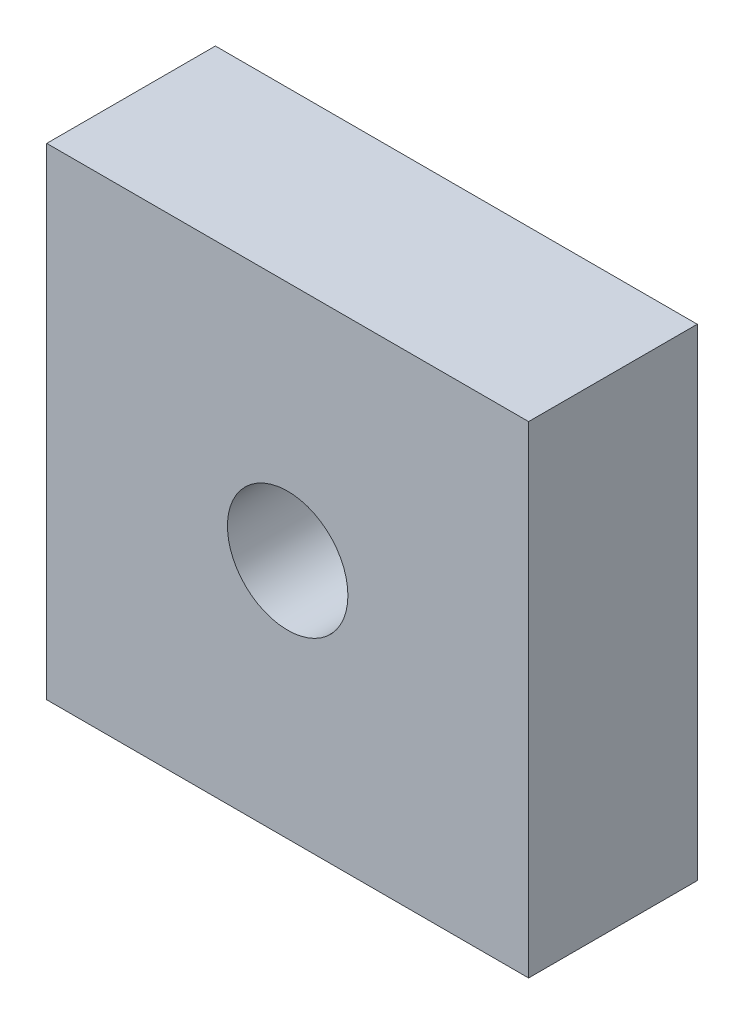
ISO-10303-21;
HEADER;
FILE_DESCRIPTION(('STEP AP214'),'2;1');
FILE_NAME('part.step','',(''),(''),'','','');
FILE_SCHEMA(('AUTOMOTIVE_DESIGN { 1 0 10303 214 1 1 1 1 }'));
ENDSEC;
DATA;
#1=APPLICATION_CONTEXT('core data for automotive mechanical design processes');
#2=APPLICATION_PROTOCOL_DEFINITION('international standard','automotive_design',2000,#1);
#3=PRODUCT_CONTEXT('',#1,'mechanical');
#4=PRODUCT('Part','Part','',(#3));
#5=PRODUCT_RELATED_PRODUCT_CATEGORY('part','',(#4));
#6=PRODUCT_DEFINITION_FORMATION('','',#4);
#7=PRODUCT_DEFINITION_CONTEXT('part definition',#1,'design');
#8=PRODUCT_DEFINITION('design','',#6,#7);
#9=PRODUCT_DEFINITION_SHAPE('','',#8);
#10=(LENGTH_UNIT() NAMED_UNIT(*) SI_UNIT(.MILLI.,.METRE.));
#11=(NAMED_UNIT(*) PLANE_ANGLE_UNIT() SI_UNIT($,.RADIAN.));
#12=(NAMED_UNIT(*) SI_UNIT($,.STERADIAN.) SOLID_ANGLE_UNIT());
#13=UNCERTAINTY_MEASURE_WITH_UNIT(LENGTH_MEASURE(1.E-05),#10,'distance_accuracy_value','');
#14=(GEOMETRIC_REPRESENTATION_CONTEXT(3) GLOBAL_UNCERTAINTY_ASSIGNED_CONTEXT((#13)) GLOBAL_UNIT_ASSIGNED_CONTEXT((#10,
#11,#12)) REPRESENTATION_CONTEXT('',''));
#15=CARTESIAN_POINT('',(0.,0.,0.));
#16=DIRECTION('',(0.,0.,1.));
#17=DIRECTION('',(1.,0.,0.));
#18=AXIS2_PLACEMENT_3D('',#15,#16,#17);
#19=CARTESIAN_POINT('',(0.,0.,7.));
#20=DIRECTION('',(0.,0.,-1.));
#21=DIRECTION('',(-1.,0.,0.));
#22=AXIS2_PLACEMENT_3D('',#19,#20,#21);
#23=PLANE('',#22);
#24=DIRECTION('',(0.,-1.,0.));
#25=VECTOR('',#24,1.);
#26=CARTESIAN_POINT('',(-10.,10.,7.));
#27=LINE('',#26,#25);
#28=CARTESIAN_POINT('',(-10.,10.,7.));
#29=VERTEX_POINT('',#28);
#30=CARTESIAN_POINT('',(-10.,-10.,7.));
#31=VERTEX_POINT('',#30);
#32=EDGE_CURVE('E89',#29,#31,#27,.T.);
#33=ORIENTED_EDGE('',*,*,#32,.T.);
#34=DIRECTION('',(1.,0.,0.));
#35=VECTOR('',#34,1.);
#36=CARTESIAN_POINT('',(10.,-10.,7.));
#37=LINE('',#36,#35);
#38=CARTESIAN_POINT('',(10.,-10.,7.));
#39=VERTEX_POINT('',#38);
#40=EDGE_CURVE('E84',#31,#39,#37,.T.);
#41=ORIENTED_EDGE('',*,*,#40,.T.);
#42=DIRECTION('',(0.,1.,0.));
#43=VECTOR('',#42,1.);
#44=CARTESIAN_POINT('',(10.,10.,7.));
#45=LINE('',#44,#43);
#46=CARTESIAN_POINT('',(10.,10.,7.));
#47=VERTEX_POINT('',#46);
#48=EDGE_CURVE('E87',#39,#47,#45,.T.);
#49=ORIENTED_EDGE('',*,*,#48,.T.);
#50=DIRECTION('',(-1.,0.,0.));
#51=VECTOR('',#50,1.);
#52=CARTESIAN_POINT('',(10.,10.,7.));
#53=LINE('',#52,#51);
#54=EDGE_CURVE('E54',#47,#29,#53,.T.);
#55=ORIENTED_EDGE('',*,*,#54,.T.);
#56=EDGE_LOOP('',(#33,#41,#49,#55));
#57=FACE_BOUND('',#56,.T.);
#58=CARTESIAN_POINT('',(0.,0.,7.));
#59=DIRECTION('',(0.,0.,1.));
#60=DIRECTION('',(1.,0.,0.));
#61=AXIS2_PLACEMENT_3D('',#58,#59,#60);
#62=CIRCLE('',#61,2.5);
#63=CARTESIAN_POINT('',(2.5,0.,7.));
#64=VERTEX_POINT('',#63);
#65=EDGE_CURVE('E104',#64,#64,#62,.T.);
#66=ORIENTED_EDGE('',*,*,#65,.F.);
#67=EDGE_LOOP('',(#66));
#68=FACE_BOUND('',#67,.T.);
#69=ADVANCED_FACE('F37',(#57,#68),#23,.F.);
#70=CARTESIAN_POINT('',(0.,0.,0.));
#71=DIRECTION('',(0.,0.,-1.));
#72=DIRECTION('',(-1.,0.,0.));
#73=AXIS2_PLACEMENT_3D('',#70,#71,#72);
#74=PLANE('',#73);
#75=DIRECTION('',(0.,-1.,0.));
#76=VECTOR('',#75,1.);
#77=CARTESIAN_POINT('',(-10.,10.,0.));
#78=LINE('',#77,#76);
#79=CARTESIAN_POINT('',(-10.,10.,0.));
#80=VERTEX_POINT('',#79);
#81=CARTESIAN_POINT('',(-10.,-10.,0.));
#82=VERTEX_POINT('',#81);
#83=EDGE_CURVE('E101',#80,#82,#78,.T.);
#84=ORIENTED_EDGE('',*,*,#83,.F.);
#85=DIRECTION('',(-1.,0.,0.));
#86=VECTOR('',#85,1.);
#87=CARTESIAN_POINT('',(10.,10.,0.));
#88=LINE('',#87,#86);
#89=CARTESIAN_POINT('',(10.,10.,0.));
#90=VERTEX_POINT('',#89);
#91=EDGE_CURVE('E77',#90,#80,#88,.T.);
#92=ORIENTED_EDGE('',*,*,#91,.F.);
#93=DIRECTION('',(0.,1.,0.));
#94=VECTOR('',#93,1.);
#95=CARTESIAN_POINT('',(10.,10.,0.));
#96=LINE('',#95,#94);
#97=CARTESIAN_POINT('',(10.,-10.,0.));
#98=VERTEX_POINT('',#97);
#99=EDGE_CURVE('E71',#98,#90,#96,.T.);
#100=ORIENTED_EDGE('',*,*,#99,.F.);
#101=DIRECTION('',(1.,0.,0.));
#102=VECTOR('',#101,1.);
#103=CARTESIAN_POINT('',(10.,-10.,0.));
#104=LINE('',#103,#102);
#105=EDGE_CURVE('E93',#82,#98,#104,.T.);
#106=ORIENTED_EDGE('',*,*,#105,.F.);
#107=EDGE_LOOP('',(#84,#92,#100,#106));
#108=FACE_BOUND('',#107,.T.);
#109=CARTESIAN_POINT('',(0.,0.,0.));
#110=DIRECTION('',(0.,0.,1.));
#111=DIRECTION('',(1.,0.,0.));
#112=AXIS2_PLACEMENT_3D('',#109,#110,#111);
#113=CIRCLE('',#112,2.5);
#114=CARTESIAN_POINT('',(2.5,0.,0.));
#115=VERTEX_POINT('',#114);
#116=EDGE_CURVE('E116',#115,#115,#113,.T.);
#117=ORIENTED_EDGE('',*,*,#116,.T.);
#118=EDGE_LOOP('',(#117));
#119=FACE_BOUND('',#118,.T.);
#120=ADVANCED_FACE('F112',(#108,#119),#74,.T.);
#121=CARTESIAN_POINT('',(-10.,10.,7.));
#122=DIRECTION('',(1.,0.,0.));
#123=DIRECTION('',(0.,1.,0.));
#124=AXIS2_PLACEMENT_3D('',#121,#122,#123);
#125=PLANE('',#124);
#126=ORIENTED_EDGE('',*,*,#83,.T.);
#127=DIRECTION('',(0.,0.,-1.));
#128=VECTOR('',#127,1.);
#129=CARTESIAN_POINT('',(-10.,-10.,7.));
#130=LINE('',#129,#128);
#131=EDGE_CURVE('E11',#31,#82,#130,.T.);
#132=ORIENTED_EDGE('',*,*,#131,.F.);
#133=ORIENTED_EDGE('',*,*,#32,.F.);
#134=DIRECTION('',(0.,0.,-1.));
#135=VECTOR('',#134,1.);
#136=CARTESIAN_POINT('',(-10.,10.,7.));
#137=LINE('',#136,#135);
#138=EDGE_CURVE('E97',#29,#80,#137,.T.);
#139=ORIENTED_EDGE('',*,*,#138,.T.);
#140=EDGE_LOOP('',(#126,#132,#133,#139));
#141=FACE_BOUND('',#140,.T.);
#142=ADVANCED_FACE('F39',(#141),#125,.F.);
#143=CARTESIAN_POINT('',(10.,-10.,7.));
#144=DIRECTION('',(0.,1.,0.));
#145=DIRECTION('',(-1.,0.,0.));
#146=AXIS2_PLACEMENT_3D('',#143,#144,#145);
#147=PLANE('',#146);
#148=ORIENTED_EDGE('',*,*,#105,.T.);
#149=DIRECTION('',(0.,0.,-1.));
#150=VECTOR('',#149,1.);
#151=CARTESIAN_POINT('',(10.,-10.,7.));
#152=LINE('',#151,#150);
#153=EDGE_CURVE('E46',#39,#98,#152,.T.);
#154=ORIENTED_EDGE('',*,*,#153,.F.);
#155=ORIENTED_EDGE('',*,*,#40,.F.);
#156=ORIENTED_EDGE('',*,*,#131,.T.);
#157=EDGE_LOOP('',(#148,#154,#155,#156));
#158=FACE_BOUND('',#157,.T.);
#159=ADVANCED_FACE('F92',(#158),#147,.F.);
#160=CARTESIAN_POINT('',(10.,10.,7.));
#161=DIRECTION('',(-1.,0.,0.));
#162=DIRECTION('',(0.,-1.,0.));
#163=AXIS2_PLACEMENT_3D('',#160,#161,#162);
#164=PLANE('',#163);
#165=ORIENTED_EDGE('',*,*,#99,.T.);
#166=DIRECTION('',(0.,0.,-1.));
#167=VECTOR('',#166,1.);
#168=CARTESIAN_POINT('',(10.,10.,7.));
#169=LINE('',#168,#167);
#170=EDGE_CURVE('E94',#47,#90,#169,.T.);
#171=ORIENTED_EDGE('',*,*,#170,.F.);
#172=ORIENTED_EDGE('',*,*,#48,.F.);
#173=ORIENTED_EDGE('',*,*,#153,.T.);
#174=EDGE_LOOP('',(#165,#171,#172,#173));
#175=FACE_BOUND('',#174,.T.);
#176=ADVANCED_FACE('F95',(#175),#164,.F.);
#177=CARTESIAN_POINT('',(10.,10.,7.));
#178=DIRECTION('',(0.,-1.,0.));
#179=DIRECTION('',(1.,0.,0.));
#180=AXIS2_PLACEMENT_3D('',#177,#178,#179);
#181=PLANE('',#180);
#182=ORIENTED_EDGE('',*,*,#91,.T.);
#183=ORIENTED_EDGE('',*,*,#138,.F.);
#184=ORIENTED_EDGE('',*,*,#54,.F.);
#185=ORIENTED_EDGE('',*,*,#170,.T.);
#186=EDGE_LOOP('',(#182,#183,#184,#185));
#187=FACE_BOUND('',#186,.T.);
#188=ADVANCED_FACE('F109',(#187),#181,.F.);
#189=CARTESIAN_POINT('',(0.,0.,7.));
#190=DIRECTION('',(0.,0.,-1.));
#191=DIRECTION('',(-1.,0.,0.));
#192=AXIS2_PLACEMENT_3D('',#189,#190,#191);
#193=CYLINDRICAL_SURFACE('',#192,2.5);
#194=ORIENTED_EDGE('',*,*,#65,.T.);
#195=EDGE_LOOP('',(#194));
#196=FACE_BOUND('',#195,.T.);
#197=ORIENTED_EDGE('',*,*,#116,.F.);
#198=EDGE_LOOP('',(#197));
#199=FACE_BOUND('',#198,.T.);
#200=ADVANCED_FACE('F122',(#196,#199),#193,.F.);
#201=CLOSED_SHELL('',(#69,#120,#142,#159,#176,#188,#200));
#202=MANIFOLD_SOLID_BREP('B2',#201);
#203=ADVANCED_BREP_SHAPE_REPRESENTATION('',(#18,#202),#14);
#204=SHAPE_DEFINITION_REPRESENTATION(#9,#203);
ENDSEC;
END-ISO-10303-21;
